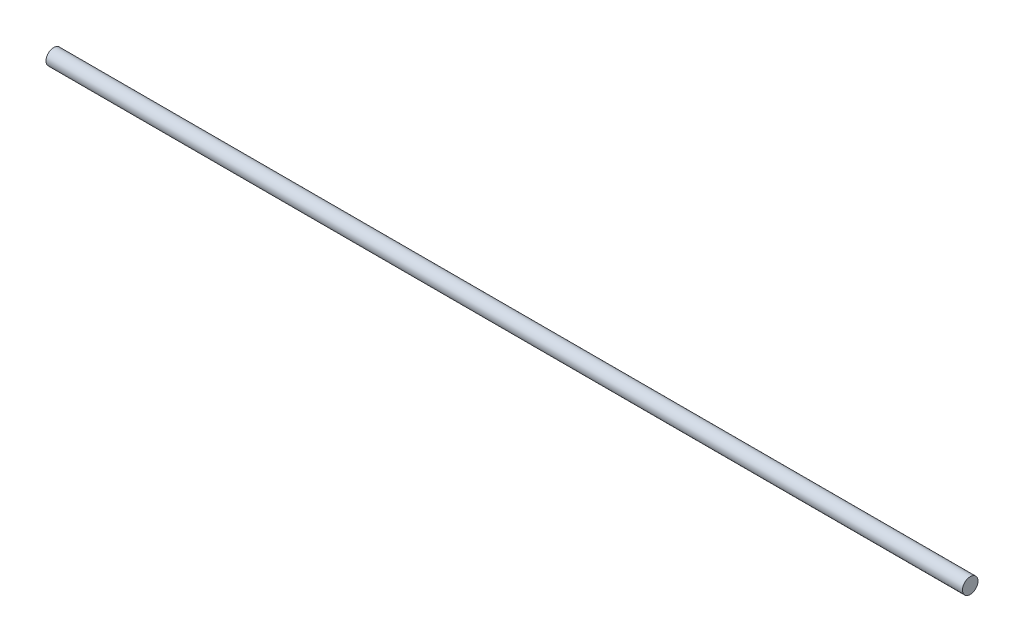
ISO-10303-21;
HEADER;
FILE_DESCRIPTION(('STEP AP214'),'2;1');
FILE_NAME('part.step','',(''),(''),'','','');
FILE_SCHEMA(('AUTOMOTIVE_DESIGN { 1 0 10303 214 1 1 1 1 }'));
ENDSEC;
DATA;
#1=APPLICATION_CONTEXT('core data for automotive mechanical design processes');
#2=APPLICATION_PROTOCOL_DEFINITION('international standard','automotive_design',2000,#1);
#3=PRODUCT_CONTEXT('',#1,'mechanical');
#4=PRODUCT('Part','Part','',(#3));
#5=PRODUCT_RELATED_PRODUCT_CATEGORY('part','',(#4));
#6=PRODUCT_DEFINITION_FORMATION('','',#4);
#7=PRODUCT_DEFINITION_CONTEXT('part definition',#1,'design');
#8=PRODUCT_DEFINITION('design','',#6,#7);
#9=PRODUCT_DEFINITION_SHAPE('','',#8);
#10=(LENGTH_UNIT() NAMED_UNIT(*) SI_UNIT(.MILLI.,.METRE.));
#11=(NAMED_UNIT(*) PLANE_ANGLE_UNIT() SI_UNIT($,.RADIAN.));
#12=(NAMED_UNIT(*) SI_UNIT($,.STERADIAN.) SOLID_ANGLE_UNIT());
#13=UNCERTAINTY_MEASURE_WITH_UNIT(LENGTH_MEASURE(1.E-05),#10,'distance_accuracy_value','');
#14=(GEOMETRIC_REPRESENTATION_CONTEXT(3) GLOBAL_UNCERTAINTY_ASSIGNED_CONTEXT((#13)) GLOBAL_UNIT_ASSIGNED_CONTEXT((#10,
#11,#12)) REPRESENTATION_CONTEXT('',''));
#15=CARTESIAN_POINT('',(0.,0.,0.));
#16=DIRECTION('',(0.,0.,1.));
#17=DIRECTION('',(1.,0.,0.));
#18=AXIS2_PLACEMENT_3D('',#15,#16,#17);
#19=CARTESIAN_POINT('',(590.,0.,0.));
#20=DIRECTION('',(-1.,0.,0.));
#21=DIRECTION('',(0.,0.,1.));
#22=AXIS2_PLACEMENT_3D('',#19,#20,#21);
#23=CYLINDRICAL_SURFACE('',#22,5.);
#24=CARTESIAN_POINT('',(590.,0.,0.));
#25=DIRECTION('',(1.,0.,0.));
#26=DIRECTION('',(0.,0.,-1.));
#27=AXIS2_PLACEMENT_3D('',#24,#25,#26);
#28=CIRCLE('',#27,5.);
#29=CARTESIAN_POINT('',(590.,0.,-5.));
#30=VERTEX_POINT('',#29);
#31=EDGE_CURVE('E10',#30,#30,#28,.T.);
#32=ORIENTED_EDGE('',*,*,#31,.F.);
#33=EDGE_LOOP('',(#32));
#34=FACE_BOUND('',#33,.T.);
#35=CARTESIAN_POINT('',(0.,0.,0.));
#36=DIRECTION('',(1.,0.,0.));
#37=DIRECTION('',(0.,0.,-1.));
#38=AXIS2_PLACEMENT_3D('',#35,#36,#37);
#39=CIRCLE('',#38,5.);
#40=CARTESIAN_POINT('',(0.,0.,-5.));
#41=VERTEX_POINT('',#40);
#42=EDGE_CURVE('E42',#41,#41,#39,.T.);
#43=ORIENTED_EDGE('',*,*,#42,.T.);
#44=EDGE_LOOP('',(#43));
#45=FACE_BOUND('',#44,.T.);
#46=ADVANCED_FACE('F39',(#34,#45),#23,.T.);
#47=CARTESIAN_POINT('',(590.,0.,0.));
#48=DIRECTION('',(1.,0.,0.));
#49=DIRECTION('',(0.,0.,-1.));
#50=AXIS2_PLACEMENT_3D('',#47,#48,#49);
#51=PLANE('',#50);
#52=ORIENTED_EDGE('',*,*,#31,.T.);
#53=EDGE_LOOP('',(#52));
#54=FACE_BOUND('',#53,.T.);
#55=ADVANCED_FACE('F54',(#54),#51,.T.);
#56=CARTESIAN_POINT('',(0.,0.,0.));
#57=DIRECTION('',(1.,0.,0.));
#58=DIRECTION('',(0.,0.,-1.));
#59=AXIS2_PLACEMENT_3D('',#56,#57,#58);
#60=PLANE('',#59);
#61=ORIENTED_EDGE('',*,*,#42,.F.);
#62=EDGE_LOOP('',(#61));
#63=FACE_BOUND('',#62,.T.);
#64=ADVANCED_FACE('F52',(#63),#60,.F.);
#65=CLOSED_SHELL('',(#46,#55,#64));
#66=MANIFOLD_SOLID_BREP('B2',#65);
#67=ADVANCED_BREP_SHAPE_REPRESENTATION('',(#18,#66),#14);
#68=SHAPE_DEFINITION_REPRESENTATION(#9,#67);
ENDSEC;
END-ISO-10303-21;
